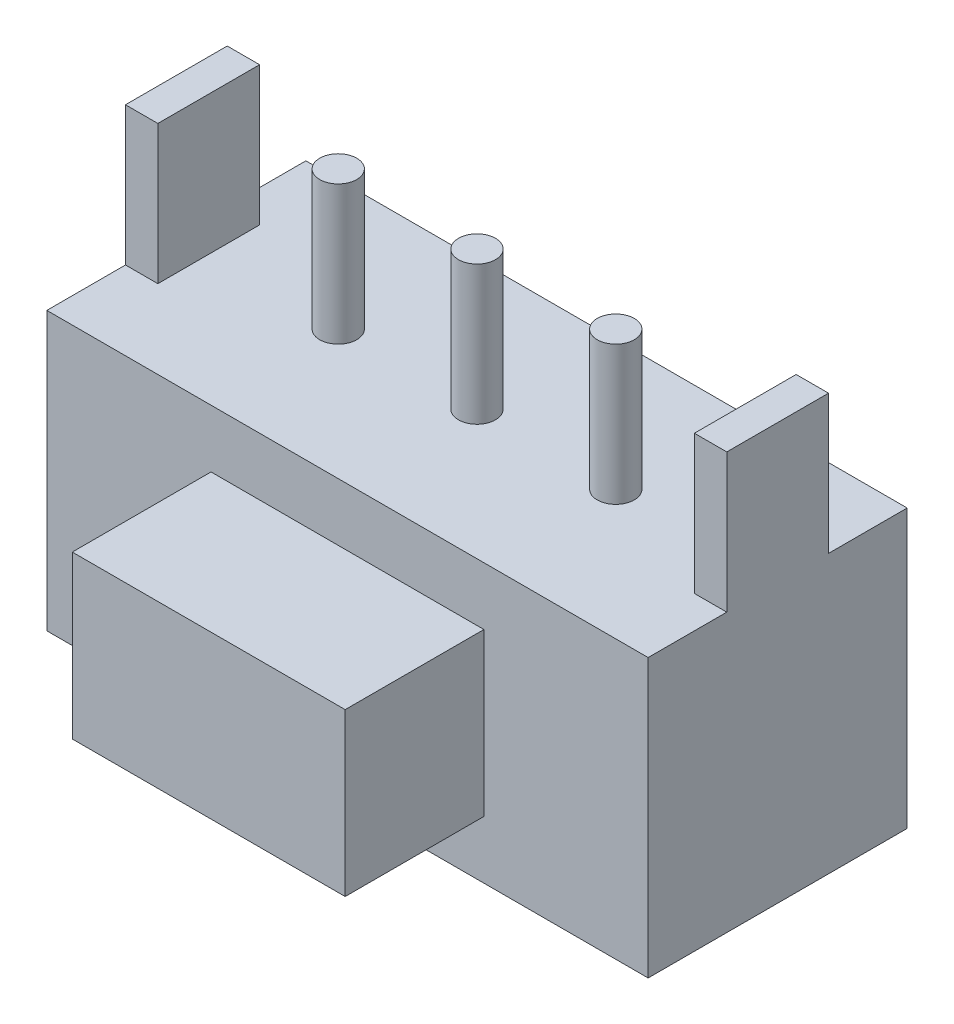
ISO-10303-21;
HEADER;
FILE_DESCRIPTION(('STEP AP214'),'2;1');
FILE_NAME('part.step','',(''),(''),'','','');
FILE_SCHEMA(('AUTOMOTIVE_DESIGN { 1 0 10303 214 1 1 1 1 }'));
ENDSEC;
DATA;
#1=APPLICATION_CONTEXT('core data for automotive mechanical design processes');
#2=APPLICATION_PROTOCOL_DEFINITION('international standard','automotive_design',2000,#1);
#3=PRODUCT_CONTEXT('',#1,'mechanical');
#4=PRODUCT('Part','Part','',(#3));
#5=PRODUCT_RELATED_PRODUCT_CATEGORY('part','',(#4));
#6=PRODUCT_DEFINITION_FORMATION('','',#4);
#7=PRODUCT_DEFINITION_CONTEXT('part definition',#1,'design');
#8=PRODUCT_DEFINITION('design','',#6,#7);
#9=PRODUCT_DEFINITION_SHAPE('','',#8);
#10=(LENGTH_UNIT() NAMED_UNIT(*) SI_UNIT(.MILLI.,.METRE.));
#11=(NAMED_UNIT(*) PLANE_ANGLE_UNIT() SI_UNIT($,.RADIAN.));
#12=(NAMED_UNIT(*) SI_UNIT($,.STERADIAN.) SOLID_ANGLE_UNIT());
#13=UNCERTAINTY_MEASURE_WITH_UNIT(LENGTH_MEASURE(1.E-05),#10,'distance_accuracy_value','');
#14=(GEOMETRIC_REPRESENTATION_CONTEXT(3) GLOBAL_UNCERTAINTY_ASSIGNED_CONTEXT((#13)) GLOBAL_UNIT_ASSIGNED_CONTEXT((#10,
#11,#12)) REPRESENTATION_CONTEXT('',''));
#15=CARTESIAN_POINT('',(0.,0.,0.));
#16=DIRECTION('',(0.,0.,1.));
#17=DIRECTION('',(1.,0.,0.));
#18=AXIS2_PLACEMENT_3D('',#15,#16,#17);
#19=CARTESIAN_POINT('',(-6.49999999999996,6.,2.8));
#20=DIRECTION('',(0.,0.,-1.));
#21=DIRECTION('',(-1.,0.,0.));
#22=AXIS2_PLACEMENT_3D('',#19,#20,#21);
#23=PLANE('',#22);
#24=DIRECTION('',(1.,0.,0.));
#25=VECTOR('',#24,1.);
#26=CARTESIAN_POINT('',(-6.49999999999996,0.,2.8));
#27=LINE('',#26,#25);
#28=CARTESIAN_POINT('',(-6.49999999999996,0.,2.8));
#29=VERTEX_POINT('',#28);
#30=CARTESIAN_POINT('',(6.49999999999998,0.,2.8));
#31=VERTEX_POINT('',#30);
#32=EDGE_CURVE('E290',#29,#31,#27,.T.);
#33=ORIENTED_EDGE('',*,*,#32,.T.);
#34=DIRECTION('',(0.,-1.,0.));
#35=VECTOR('',#34,1.);
#36=CARTESIAN_POINT('',(6.49999999999998,6.,2.8));
#37=LINE('',#36,#35);
#38=CARTESIAN_POINT('',(6.49999999999998,6.,2.8));
#39=VERTEX_POINT('',#38);
#40=EDGE_CURVE('E287',#39,#31,#37,.T.);
#41=ORIENTED_EDGE('',*,*,#40,.F.);
#42=DIRECTION('',(1.,0.,0.));
#43=VECTOR('',#42,1.);
#44=CARTESIAN_POINT('',(-6.49999999999996,6.,2.8));
#45=LINE('',#44,#43);
#46=CARTESIAN_POINT('',(-6.49999999999996,6.,2.8));
#47=VERTEX_POINT('',#46);
#48=EDGE_CURVE('E274',#47,#39,#45,.T.);
#49=ORIENTED_EDGE('',*,*,#48,.F.);
#50=DIRECTION('',(0.,-1.,0.));
#51=VECTOR('',#50,1.);
#52=CARTESIAN_POINT('',(-6.49999999999996,6.,2.8));
#53=LINE('',#52,#51);
#54=EDGE_CURVE('E284',#47,#29,#53,.T.);
#55=ORIENTED_EDGE('',*,*,#54,.T.);
#56=EDGE_LOOP('',(#33,#41,#49,#55));
#57=FACE_BOUND('',#56,.T.);
#58=DIRECTION('',(0.,1.,0.));
#59=VECTOR('',#58,1.);
#60=CARTESIAN_POINT('',(2.94999999999998,4.75,2.8));
#61=LINE('',#60,#59);
#62=CARTESIAN_POINT('',(2.94999999999998,1.25,2.8));
#63=VERTEX_POINT('',#62);
#64=CARTESIAN_POINT('',(2.94999999999998,4.75,2.8));
#65=VERTEX_POINT('',#64);
#66=EDGE_CURVE('E170',#63,#65,#61,.T.);
#67=ORIENTED_EDGE('',*,*,#66,.F.);
#68=DIRECTION('',(1.,0.,0.));
#69=VECTOR('',#68,1.);
#70=CARTESIAN_POINT('',(-2.94999999999998,1.25,2.8));
#71=LINE('',#70,#69);
#72=CARTESIAN_POINT('',(-2.94999999999998,1.25,2.8));
#73=VERTEX_POINT('',#72);
#74=EDGE_CURVE('E167',#73,#63,#71,.T.);
#75=ORIENTED_EDGE('',*,*,#74,.F.);
#76=DIRECTION('',(0.,-1.,0.));
#77=VECTOR('',#76,1.);
#78=CARTESIAN_POINT('',(-2.94999999999998,4.75,2.8));
#79=LINE('',#78,#77);
#80=CARTESIAN_POINT('',(-2.94999999999998,4.75,2.8));
#81=VERTEX_POINT('',#80);
#82=EDGE_CURVE('E57',#81,#73,#79,.T.);
#83=ORIENTED_EDGE('',*,*,#82,.F.);
#84=DIRECTION('',(-1.,0.,0.));
#85=VECTOR('',#84,1.);
#86=CARTESIAN_POINT('',(-2.94999999999998,4.75,2.8));
#87=LINE('',#86,#85);
#88=EDGE_CURVE('E52',#65,#81,#87,.T.);
#89=ORIENTED_EDGE('',*,*,#88,.F.);
#90=EDGE_LOOP('',(#67,#75,#83,#89));
#91=FACE_BOUND('',#90,.T.);
#92=ADVANCED_FACE('F35',(#57,#91),#23,.F.);
#93=CARTESIAN_POINT('',(0.,6.,0.));
#94=DIRECTION('',(0.,1.,0.));
#95=DIRECTION('',(0.,0.,1.));
#96=AXIS2_PLACEMENT_3D('',#93,#94,#95);
#97=PLANE('',#96);
#98=CARTESIAN_POINT('',(0.,6.,0.));
#99=DIRECTION('',(0.,1.,0.));
#100=DIRECTION('',(0.,0.,1.));
#101=AXIS2_PLACEMENT_3D('',#98,#99,#100);
#102=CIRCLE('',#101,0.4);
#103=CARTESIAN_POINT('',(0.,6.,0.400000000000002));
#104=VERTEX_POINT('',#103);
#105=EDGE_CURVE('E181',#104,#104,#102,.T.);
#106=ORIENTED_EDGE('',*,*,#105,.F.);
#107=EDGE_LOOP('',(#106));
#108=FACE_BOUND('',#107,.T.);
#109=CARTESIAN_POINT('',(-3.,6.,0.));
#110=DIRECTION('',(0.,1.,0.));
#111=DIRECTION('',(0.,0.,1.));
#112=AXIS2_PLACEMENT_3D('',#109,#110,#111);
#113=CIRCLE('',#112,0.4);
#114=CARTESIAN_POINT('',(-3.,6.,0.400000000000002));
#115=VERTEX_POINT('',#114);
#116=EDGE_CURVE('E218',#115,#115,#113,.T.);
#117=ORIENTED_EDGE('',*,*,#116,.F.);
#118=EDGE_LOOP('',(#117));
#119=FACE_BOUND('',#118,.T.);
#120=DIRECTION('',(0.,0.,1.));
#121=VECTOR('',#120,1.);
#122=CARTESIAN_POINT('',(5.79999999999997,6.,1.09999999999999));
#123=LINE('',#122,#121);
#124=CARTESIAN_POINT('',(5.79999999999997,6.,-1.10000000000001));
#125=VERTEX_POINT('',#124);
#126=CARTESIAN_POINT('',(5.79999999999997,6.,1.09999999999999));
#127=VERTEX_POINT('',#126);
#128=EDGE_CURVE('E202',#125,#127,#123,.T.);
#129=ORIENTED_EDGE('',*,*,#128,.F.);
#130=DIRECTION('',(-1.,0.,0.));
#131=VECTOR('',#130,1.);
#132=CARTESIAN_POINT('',(6.49999999999997,6.,-1.10000000000001));
#133=LINE('',#132,#131);
#134=CARTESIAN_POINT('',(6.49999999999997,6.,-1.10000000000001));
#135=VERTEX_POINT('',#134);
#136=EDGE_CURVE('E186',#135,#125,#133,.T.);
#137=ORIENTED_EDGE('',*,*,#136,.F.);
#138=DIRECTION('',(0.,0.,-1.));
#139=VECTOR('',#138,1.);
#140=CARTESIAN_POINT('',(6.49999999999999,6.,-2.8));
#141=LINE('',#140,#139);
#142=CARTESIAN_POINT('',(6.49999999999999,6.,-2.8));
#143=VERTEX_POINT('',#142);
#144=EDGE_CURVE('E269',#135,#143,#141,.T.);
#145=ORIENTED_EDGE('',*,*,#144,.T.);
#146=DIRECTION('',(-1.,0.,0.));
#147=VECTOR('',#146,1.);
#148=CARTESIAN_POINT('',(-6.49999999999999,6.,-2.8));
#149=LINE('',#148,#147);
#150=CARTESIAN_POINT('',(-6.49999999999999,6.,-2.8));
#151=VERTEX_POINT('',#150);
#152=EDGE_CURVE('E268',#143,#151,#149,.T.);
#153=ORIENTED_EDGE('',*,*,#152,.T.);
#154=DIRECTION('',(0.,0.,1.));
#155=VECTOR('',#154,1.);
#156=CARTESIAN_POINT('',(-6.49999999999999,6.,-2.8));
#157=LINE('',#156,#155);
#158=CARTESIAN_POINT('',(-6.49999999999998,6.,-1.1));
#159=VERTEX_POINT('',#158);
#160=EDGE_CURVE('E280',#151,#159,#157,.T.);
#161=ORIENTED_EDGE('',*,*,#160,.T.);
#162=DIRECTION('',(-1.,0.,0.));
#163=VECTOR('',#162,1.);
#164=CARTESIAN_POINT('',(-6.49999999999996,6.,-1.1));
#165=LINE('',#164,#163);
#166=CARTESIAN_POINT('',(-5.79999999999996,6.,-1.1));
#167=VERTEX_POINT('',#166);
#168=EDGE_CURVE('E229',#167,#159,#165,.T.);
#169=ORIENTED_EDGE('',*,*,#168,.F.);
#170=DIRECTION('',(0.,0.,-1.));
#171=VECTOR('',#170,1.);
#172=CARTESIAN_POINT('',(-5.79999999999996,6.,1.1));
#173=LINE('',#172,#171);
#174=CARTESIAN_POINT('',(-5.79999999999996,6.,1.1));
#175=VERTEX_POINT('',#174);
#176=EDGE_CURVE('E236',#175,#167,#173,.T.);
#177=ORIENTED_EDGE('',*,*,#176,.F.);
#178=DIRECTION('',(1.,0.,0.));
#179=VECTOR('',#178,1.);
#180=CARTESIAN_POINT('',(-6.49999999999996,6.,1.1));
#181=LINE('',#180,#179);
#182=CARTESIAN_POINT('',(-6.49999999999997,6.,1.1));
#183=VERTEX_POINT('',#182);
#184=EDGE_CURVE('E222',#183,#175,#181,.T.);
#185=ORIENTED_EDGE('',*,*,#184,.F.);
#186=EDGE_CURVE('E271',#183,#47,#157,.T.);
#187=ORIENTED_EDGE('',*,*,#186,.T.);
#188=ORIENTED_EDGE('',*,*,#48,.T.);
#189=CARTESIAN_POINT('',(6.49999999999998,6.,1.09999999999999));
#190=VERTEX_POINT('',#189);
#191=EDGE_CURVE('E266',#39,#190,#141,.T.);
#192=ORIENTED_EDGE('',*,*,#191,.T.);
#193=DIRECTION('',(1.,0.,0.));
#194=VECTOR('',#193,1.);
#195=CARTESIAN_POINT('',(6.49999999999997,6.,1.09999999999999));
#196=LINE('',#195,#194);
#197=EDGE_CURVE('E193',#127,#190,#196,.T.);
#198=ORIENTED_EDGE('',*,*,#197,.F.);
#199=EDGE_LOOP('',(#129,#137,#145,#153,#161,#169,#177,#185,#187,#188,#192,#198));
#200=FACE_BOUND('',#199,.T.);
#201=CARTESIAN_POINT('',(3.,6.,0.));
#202=DIRECTION('',(0.,1.,0.));
#203=DIRECTION('',(0.,0.,1.));
#204=AXIS2_PLACEMENT_3D('',#201,#202,#203);
#205=CIRCLE('',#204,0.4);
#206=CARTESIAN_POINT('',(3.,6.,0.400000000000002));
#207=VERTEX_POINT('',#206);
#208=EDGE_CURVE('E171',#207,#207,#205,.T.);
#209=ORIENTED_EDGE('',*,*,#208,.F.);
#210=EDGE_LOOP('',(#209));
#211=FACE_BOUND('',#210,.T.);
#212=ADVANCED_FACE('F310',(#108,#119,#200,#211),#97,.T.);
#213=CARTESIAN_POINT('',(6.49999999999999,6.,-2.8));
#214=DIRECTION('',(-1.,0.,0.));
#215=DIRECTION('',(0.,0.,1.));
#216=AXIS2_PLACEMENT_3D('',#213,#214,#215);
#217=PLANE('',#216);
#218=DIRECTION('',(0.,0.,-1.));
#219=VECTOR('',#218,1.);
#220=CARTESIAN_POINT('',(6.49999999999999,0.,-2.8));
#221=LINE('',#220,#219);
#222=CARTESIAN_POINT('',(6.49999999999999,0.,-2.8));
#223=VERTEX_POINT('',#222);
#224=EDGE_CURVE('E264',#31,#223,#221,.T.);
#225=ORIENTED_EDGE('',*,*,#224,.T.);
#226=DIRECTION('',(0.,-1.,0.));
#227=VECTOR('',#226,1.);
#228=CARTESIAN_POINT('',(6.49999999999999,6.,-2.8));
#229=LINE('',#228,#227);
#230=EDGE_CURVE('E11',#143,#223,#229,.T.);
#231=ORIENTED_EDGE('',*,*,#230,.F.);
#232=ORIENTED_EDGE('',*,*,#144,.F.);
#233=DIRECTION('',(0.,-1.,0.));
#234=VECTOR('',#233,1.);
#235=CARTESIAN_POINT('',(6.49999999999997,9.,-1.10000000000001));
#236=LINE('',#235,#234);
#237=CARTESIAN_POINT('',(6.49999999999997,9.,-1.10000000000001));
#238=VERTEX_POINT('',#237);
#239=EDGE_CURVE('E215',#238,#135,#236,.T.);
#240=ORIENTED_EDGE('',*,*,#239,.F.);
#241=DIRECTION('',(0.,0.,-1.));
#242=VECTOR('',#241,1.);
#243=CARTESIAN_POINT('',(6.49999999999997,9.,1.09999999999999));
#244=LINE('',#243,#242);
#245=CARTESIAN_POINT('',(6.49999999999997,9.,1.09999999999999));
#246=VERTEX_POINT('',#245);
#247=EDGE_CURVE('E189',#246,#238,#244,.T.);
#248=ORIENTED_EDGE('',*,*,#247,.F.);
#249=DIRECTION('',(0.,-1.,0.));
#250=VECTOR('',#249,1.);
#251=CARTESIAN_POINT('',(6.49999999999997,9.,1.09999999999999));
#252=LINE('',#251,#250);
#253=EDGE_CURVE('E199',#246,#190,#252,.T.);
#254=ORIENTED_EDGE('',*,*,#253,.T.);
#255=ORIENTED_EDGE('',*,*,#191,.F.);
#256=ORIENTED_EDGE('',*,*,#40,.T.);
#257=EDGE_LOOP('',(#225,#231,#232,#240,#248,#254,#255,#256));
#258=FACE_BOUND('',#257,.T.);
#259=ADVANCED_FACE('F37',(#258),#217,.F.);
#260=CARTESIAN_POINT('',(-6.49999999999999,6.,-2.8));
#261=DIRECTION('',(0.,0.,1.));
#262=DIRECTION('',(1.,0.,0.));
#263=AXIS2_PLACEMENT_3D('',#260,#261,#262);
#264=PLANE('',#263);
#265=DIRECTION('',(-1.,0.,0.));
#266=VECTOR('',#265,1.);
#267=CARTESIAN_POINT('',(-6.49999999999999,0.,-2.8));
#268=LINE('',#267,#266);
#269=CARTESIAN_POINT('',(-6.49999999999999,0.,-2.8));
#270=VERTEX_POINT('',#269);
#271=EDGE_CURVE('E294',#223,#270,#268,.T.);
#272=ORIENTED_EDGE('',*,*,#271,.T.);
#273=DIRECTION('',(0.,-1.,0.));
#274=VECTOR('',#273,1.);
#275=CARTESIAN_POINT('',(-6.49999999999999,6.,-2.8));
#276=LINE('',#275,#274);
#277=EDGE_CURVE('E44',#151,#270,#276,.T.);
#278=ORIENTED_EDGE('',*,*,#277,.F.);
#279=ORIENTED_EDGE('',*,*,#152,.F.);
#280=ORIENTED_EDGE('',*,*,#230,.T.);
#281=EDGE_LOOP('',(#272,#278,#279,#280));
#282=FACE_BOUND('',#281,.T.);
#283=ADVANCED_FACE('F308',(#282),#264,.F.);
#284=CARTESIAN_POINT('',(-6.49999999999999,6.,-2.8));
#285=DIRECTION('',(1.,0.,0.));
#286=DIRECTION('',(0.,0.,-1.));
#287=AXIS2_PLACEMENT_3D('',#284,#285,#286);
#288=PLANE('',#287);
#289=DIRECTION('',(0.,0.,1.));
#290=VECTOR('',#289,1.);
#291=CARTESIAN_POINT('',(-6.49999999999999,0.,-2.8));
#292=LINE('',#291,#290);
#293=EDGE_CURVE('E292',#270,#29,#292,.T.);
#294=ORIENTED_EDGE('',*,*,#293,.T.);
#295=ORIENTED_EDGE('',*,*,#54,.F.);
#296=ORIENTED_EDGE('',*,*,#186,.F.);
#297=DIRECTION('',(0.,-1.,0.));
#298=VECTOR('',#297,1.);
#299=CARTESIAN_POINT('',(-6.49999999999996,9.,1.1));
#300=LINE('',#299,#298);
#301=CARTESIAN_POINT('',(-6.49999999999996,9.,1.1));
#302=VERTEX_POINT('',#301);
#303=EDGE_CURVE('E259',#302,#183,#300,.T.);
#304=ORIENTED_EDGE('',*,*,#303,.F.);
#305=DIRECTION('',(0.,0.,1.));
#306=VECTOR('',#305,1.);
#307=CARTESIAN_POINT('',(-6.49999999999996,9.,1.1));
#308=LINE('',#307,#306);
#309=CARTESIAN_POINT('',(-6.49999999999996,9.,-1.1));
#310=VERTEX_POINT('',#309);
#311=EDGE_CURVE('E225',#310,#302,#308,.T.);
#312=ORIENTED_EDGE('',*,*,#311,.F.);
#313=DIRECTION('',(0.,-1.,0.));
#314=VECTOR('',#313,1.);
#315=CARTESIAN_POINT('',(-6.49999999999996,9.,-1.1));
#316=LINE('',#315,#314);
#317=EDGE_CURVE('E235',#310,#159,#316,.T.);
#318=ORIENTED_EDGE('',*,*,#317,.T.);
#319=ORIENTED_EDGE('',*,*,#160,.F.);
#320=ORIENTED_EDGE('',*,*,#277,.T.);
#321=EDGE_LOOP('',(#294,#295,#296,#304,#312,#318,#319,#320));
#322=FACE_BOUND('',#321,.T.);
#323=ADVANCED_FACE('F330',(#322),#288,.F.);
#324=CARTESIAN_POINT('',(0.,0.,0.));
#325=DIRECTION('',(0.,1.,0.));
#326=DIRECTION('',(0.,0.,1.));
#327=AXIS2_PLACEMENT_3D('',#324,#325,#326);
#328=PLANE('',#327);
#329=ORIENTED_EDGE('',*,*,#224,.F.);
#330=ORIENTED_EDGE('',*,*,#32,.F.);
#331=ORIENTED_EDGE('',*,*,#293,.F.);
#332=ORIENTED_EDGE('',*,*,#271,.F.);
#333=EDGE_LOOP('',(#329,#330,#331,#332));
#334=FACE_BOUND('',#333,.T.);
#335=ADVANCED_FACE('F303',(#334),#328,.F.);
#336=CARTESIAN_POINT('',(-6.49999999999996,9.,1.1));
#337=DIRECTION('',(0.,0.,-1.));
#338=DIRECTION('',(-1.,0.,0.));
#339=AXIS2_PLACEMENT_3D('',#336,#337,#338);
#340=PLANE('',#339);
#341=ORIENTED_EDGE('',*,*,#184,.T.);
#342=DIRECTION('',(0.,-1.,0.));
#343=VECTOR('',#342,1.);
#344=CARTESIAN_POINT('',(-5.79999999999996,9.,1.1));
#345=LINE('',#344,#343);
#346=CARTESIAN_POINT('',(-5.79999999999996,9.,1.1));
#347=VERTEX_POINT('',#346);
#348=EDGE_CURVE('E254',#347,#175,#345,.T.);
#349=ORIENTED_EDGE('',*,*,#348,.F.);
#350=DIRECTION('',(1.,0.,0.));
#351=VECTOR('',#350,1.);
#352=CARTESIAN_POINT('',(-6.49999999999996,9.,1.1));
#353=LINE('',#352,#351);
#354=EDGE_CURVE('E228',#302,#347,#353,.T.);
#355=ORIENTED_EDGE('',*,*,#354,.F.);
#356=ORIENTED_EDGE('',*,*,#303,.T.);
#357=EDGE_LOOP('',(#341,#349,#355,#356));
#358=FACE_BOUND('',#357,.T.);
#359=ADVANCED_FACE('F334',(#358),#340,.F.);
#360=CARTESIAN_POINT('',(-5.79999999999996,9.,1.1));
#361=DIRECTION('',(-1.,0.,0.));
#362=DIRECTION('',(0.,0.,1.));
#363=AXIS2_PLACEMENT_3D('',#360,#361,#362);
#364=PLANE('',#363);
#365=ORIENTED_EDGE('',*,*,#176,.T.);
#366=DIRECTION('',(0.,-1.,0.));
#367=VECTOR('',#366,1.);
#368=CARTESIAN_POINT('',(-5.79999999999996,9.,-1.1));
#369=LINE('',#368,#367);
#370=CARTESIAN_POINT('',(-5.79999999999996,9.,-1.1));
#371=VERTEX_POINT('',#370);
#372=EDGE_CURVE('E241',#371,#167,#369,.T.);
#373=ORIENTED_EDGE('',*,*,#372,.F.);
#374=DIRECTION('',(0.,0.,-1.));
#375=VECTOR('',#374,1.);
#376=CARTESIAN_POINT('',(-5.79999999999996,9.,1.1));
#377=LINE('',#376,#375);
#378=EDGE_CURVE('E231',#347,#371,#377,.T.);
#379=ORIENTED_EDGE('',*,*,#378,.F.);
#380=ORIENTED_EDGE('',*,*,#348,.T.);
#381=EDGE_LOOP('',(#365,#373,#379,#380));
#382=FACE_BOUND('',#381,.T.);
#383=ADVANCED_FACE('F338',(#382),#364,.F.);
#384=CARTESIAN_POINT('',(-6.49999999999996,9.,-1.1));
#385=DIRECTION('',(0.,0.,1.));
#386=DIRECTION('',(1.,0.,0.));
#387=AXIS2_PLACEMENT_3D('',#384,#385,#386);
#388=PLANE('',#387);
#389=ORIENTED_EDGE('',*,*,#168,.T.);
#390=ORIENTED_EDGE('',*,*,#317,.F.);
#391=DIRECTION('',(-1.,0.,0.));
#392=VECTOR('',#391,1.);
#393=CARTESIAN_POINT('',(-6.49999999999996,9.,-1.1));
#394=LINE('',#393,#392);
#395=EDGE_CURVE('E233',#371,#310,#394,.T.);
#396=ORIENTED_EDGE('',*,*,#395,.F.);
#397=ORIENTED_EDGE('',*,*,#372,.T.);
#398=EDGE_LOOP('',(#389,#390,#396,#397));
#399=FACE_BOUND('',#398,.T.);
#400=ADVANCED_FACE('F337',(#399),#388,.F.);
#401=CARTESIAN_POINT('',(0.,9.,0.));
#402=DIRECTION('',(0.,-1.,0.));
#403=DIRECTION('',(0.,0.,-1.));
#404=AXIS2_PLACEMENT_3D('',#401,#402,#403);
#405=PLANE('',#404);
#406=ORIENTED_EDGE('',*,*,#311,.T.);
#407=ORIENTED_EDGE('',*,*,#354,.T.);
#408=ORIENTED_EDGE('',*,*,#378,.T.);
#409=ORIENTED_EDGE('',*,*,#395,.T.);
#410=EDGE_LOOP('',(#406,#407,#408,#409));
#411=FACE_BOUND('',#410,.T.);
#412=ADVANCED_FACE('F336',(#411),#405,.F.);
#413=CARTESIAN_POINT('',(-3.,9.,0.));
#414=DIRECTION('',(0.,-1.,0.));
#415=DIRECTION('',(0.,0.,-1.));
#416=AXIS2_PLACEMENT_3D('',#413,#414,#415);
#417=CYLINDRICAL_SURFACE('',#416,0.4);
#418=CARTESIAN_POINT('',(-3.,9.,0.));
#419=DIRECTION('',(0.,1.,0.));
#420=DIRECTION('',(0.,0.,1.));
#421=AXIS2_PLACEMENT_3D('',#418,#419,#420);
#422=CIRCLE('',#421,0.4);
#423=CARTESIAN_POINT('',(-3.,9.,0.400000000000002));
#424=VERTEX_POINT('',#423);
#425=EDGE_CURVE('E219',#424,#424,#422,.T.);
#426=ORIENTED_EDGE('',*,*,#425,.F.);
#427=EDGE_LOOP('',(#426));
#428=FACE_BOUND('',#427,.T.);
#429=ORIENTED_EDGE('',*,*,#116,.T.);
#430=EDGE_LOOP('',(#429));
#431=FACE_BOUND('',#430,.T.);
#432=ADVANCED_FACE('F415',(#428,#431),#417,.T.);
#433=CARTESIAN_POINT('',(-3.,9.,0.));
#434=DIRECTION('',(0.,1.,0.));
#435=DIRECTION('',(0.,0.,1.));
#436=AXIS2_PLACEMENT_3D('',#433,#434,#435);
#437=PLANE('',#436);
#438=ORIENTED_EDGE('',*,*,#425,.T.);
#439=EDGE_LOOP('',(#438));
#440=FACE_BOUND('',#439,.T.);
#441=ADVANCED_FACE('F423',(#440),#437,.T.);
#442=CARTESIAN_POINT('',(6.49999999999997,9.,-1.10000000000001));
#443=DIRECTION('',(0.,0.,1.));
#444=DIRECTION('',(1.,0.,0.));
#445=AXIS2_PLACEMENT_3D('',#442,#443,#444);
#446=PLANE('',#445);
#447=ORIENTED_EDGE('',*,*,#136,.T.);
#448=DIRECTION('',(0.,-1.,0.));
#449=VECTOR('',#448,1.);
#450=CARTESIAN_POINT('',(5.79999999999997,9.,-1.10000000000001));
#451=LINE('',#450,#449);
#452=CARTESIAN_POINT('',(5.79999999999997,9.,-1.10000000000001));
#453=VERTEX_POINT('',#452);
#454=EDGE_CURVE('E212',#453,#125,#451,.T.);
#455=ORIENTED_EDGE('',*,*,#454,.F.);
#456=DIRECTION('',(-1.,0.,0.));
#457=VECTOR('',#456,1.);
#458=CARTESIAN_POINT('',(6.49999999999997,9.,-1.10000000000001));
#459=LINE('',#458,#457);
#460=EDGE_CURVE('E192',#238,#453,#459,.T.);
#461=ORIENTED_EDGE('',*,*,#460,.F.);
#462=ORIENTED_EDGE('',*,*,#239,.T.);
#463=EDGE_LOOP('',(#447,#455,#461,#462));
#464=FACE_BOUND('',#463,.T.);
#465=ADVANCED_FACE('F316',(#464),#446,.F.);
#466=CARTESIAN_POINT('',(5.79999999999997,9.,1.09999999999999));
#467=DIRECTION('',(1.,0.,0.));
#468=DIRECTION('',(0.,0.,-1.));
#469=AXIS2_PLACEMENT_3D('',#466,#467,#468);
#470=PLANE('',#469);
#471=ORIENTED_EDGE('',*,*,#128,.T.);
#472=DIRECTION('',(0.,-1.,0.));
#473=VECTOR('',#472,1.);
#474=CARTESIAN_POINT('',(5.79999999999997,9.,1.09999999999999));
#475=LINE('',#474,#473);
#476=CARTESIAN_POINT('',(5.79999999999997,9.,1.09999999999999));
#477=VERTEX_POINT('',#476);
#478=EDGE_CURVE('E209',#477,#127,#475,.T.);
#479=ORIENTED_EDGE('',*,*,#478,.F.);
#480=DIRECTION('',(0.,0.,1.));
#481=VECTOR('',#480,1.);
#482=CARTESIAN_POINT('',(5.79999999999997,9.,1.09999999999999));
#483=LINE('',#482,#481);
#484=EDGE_CURVE('E195',#453,#477,#483,.T.);
#485=ORIENTED_EDGE('',*,*,#484,.F.);
#486=ORIENTED_EDGE('',*,*,#454,.T.);
#487=EDGE_LOOP('',(#471,#479,#485,#486));
#488=FACE_BOUND('',#487,.T.);
#489=ADVANCED_FACE('F441',(#488),#470,.F.);
#490=CARTESIAN_POINT('',(6.49999999999997,9.,1.09999999999999));
#491=DIRECTION('',(0.,0.,-1.));
#492=DIRECTION('',(-1.,0.,0.));
#493=AXIS2_PLACEMENT_3D('',#490,#491,#492);
#494=PLANE('',#493);
#495=ORIENTED_EDGE('',*,*,#197,.T.);
#496=ORIENTED_EDGE('',*,*,#253,.F.);
#497=DIRECTION('',(1.,0.,0.));
#498=VECTOR('',#497,1.);
#499=CARTESIAN_POINT('',(6.49999999999997,9.,1.09999999999999));
#500=LINE('',#499,#498);
#501=EDGE_CURVE('E197',#477,#246,#500,.T.);
#502=ORIENTED_EDGE('',*,*,#501,.F.);
#503=ORIENTED_EDGE('',*,*,#478,.T.);
#504=EDGE_LOOP('',(#495,#496,#502,#503));
#505=FACE_BOUND('',#504,.T.);
#506=ADVANCED_FACE('F325',(#505),#494,.F.);
#507=CARTESIAN_POINT('',(0.,9.,0.));
#508=DIRECTION('',(0.,1.,0.));
#509=DIRECTION('',(0.,0.,1.));
#510=AXIS2_PLACEMENT_3D('',#507,#508,#509);
#511=PLANE('',#510);
#512=ORIENTED_EDGE('',*,*,#247,.T.);
#513=ORIENTED_EDGE('',*,*,#460,.T.);
#514=ORIENTED_EDGE('',*,*,#484,.T.);
#515=ORIENTED_EDGE('',*,*,#501,.T.);
#516=EDGE_LOOP('',(#512,#513,#514,#515));
#517=FACE_BOUND('',#516,.T.);
#518=ADVANCED_FACE('F320',(#517),#511,.T.);
#519=CARTESIAN_POINT('',(0.,9.,0.));
#520=DIRECTION('',(0.,-1.,0.));
#521=DIRECTION('',(0.,0.,-1.));
#522=AXIS2_PLACEMENT_3D('',#519,#520,#521);
#523=CYLINDRICAL_SURFACE('',#522,0.4);
#524=CARTESIAN_POINT('',(0.,9.,0.));
#525=DIRECTION('',(0.,1.,0.));
#526=DIRECTION('',(0.,0.,1.));
#527=AXIS2_PLACEMENT_3D('',#524,#525,#526);
#528=CIRCLE('',#527,0.4);
#529=CARTESIAN_POINT('',(0.,9.,0.400000000000002));
#530=VERTEX_POINT('',#529);
#531=EDGE_CURVE('E183',#530,#530,#528,.T.);
#532=ORIENTED_EDGE('',*,*,#531,.F.);
#533=EDGE_LOOP('',(#532));
#534=FACE_BOUND('',#533,.T.);
#535=ORIENTED_EDGE('',*,*,#105,.T.);
#536=EDGE_LOOP('',(#535));
#537=FACE_BOUND('',#536,.T.);
#538=ADVANCED_FACE('F464',(#534,#537),#523,.T.);
#539=CARTESIAN_POINT('',(0.,9.,0.));
#540=DIRECTION('',(0.,1.,0.));
#541=DIRECTION('',(0.,0.,1.));
#542=AXIS2_PLACEMENT_3D('',#539,#540,#541);
#543=PLANE('',#542);
#544=ORIENTED_EDGE('',*,*,#531,.T.);
#545=EDGE_LOOP('',(#544));
#546=FACE_BOUND('',#545,.T.);
#547=ADVANCED_FACE('F472',(#546),#543,.T.);
#548=CARTESIAN_POINT('',(3.,9.,0.));
#549=DIRECTION('',(0.,-1.,0.));
#550=DIRECTION('',(0.,0.,-1.));
#551=AXIS2_PLACEMENT_3D('',#548,#549,#550);
#552=CYLINDRICAL_SURFACE('',#551,0.4);
#553=CARTESIAN_POINT('',(3.,9.,0.));
#554=DIRECTION('',(0.,1.,0.));
#555=DIRECTION('',(0.,0.,1.));
#556=AXIS2_PLACEMENT_3D('',#553,#554,#555);
#557=CIRCLE('',#556,0.4);
#558=CARTESIAN_POINT('',(3.,9.,0.400000000000002));
#559=VERTEX_POINT('',#558);
#560=EDGE_CURVE('E174',#559,#559,#557,.T.);
#561=ORIENTED_EDGE('',*,*,#560,.F.);
#562=EDGE_LOOP('',(#561));
#563=FACE_BOUND('',#562,.T.);
#564=ORIENTED_EDGE('',*,*,#208,.T.);
#565=EDGE_LOOP('',(#564));
#566=FACE_BOUND('',#565,.T.);
#567=ADVANCED_FACE('F482',(#563,#566),#552,.T.);
#568=CARTESIAN_POINT('',(3.,9.,0.));
#569=DIRECTION('',(0.,1.,0.));
#570=DIRECTION('',(0.,0.,1.));
#571=AXIS2_PLACEMENT_3D('',#568,#569,#570);
#572=PLANE('',#571);
#573=ORIENTED_EDGE('',*,*,#560,.T.);
#574=EDGE_LOOP('',(#573));
#575=FACE_BOUND('',#574,.T.);
#576=ADVANCED_FACE('F491',(#575),#572,.T.);
#577=CARTESIAN_POINT('',(2.94999999999998,4.75,5.8));
#578=DIRECTION('',(-1.,0.,0.));
#579=DIRECTION('',(0.,-1.,0.));
#580=AXIS2_PLACEMENT_3D('',#577,#578,#579);
#581=PLANE('',#580);
#582=ORIENTED_EDGE('',*,*,#66,.T.);
#583=DIRECTION('',(0.,0.,-1.));
#584=VECTOR('',#583,1.);
#585=CARTESIAN_POINT('',(2.94999999999998,4.75,5.8));
#586=LINE('',#585,#584);
#587=CARTESIAN_POINT('',(2.94999999999998,4.75,5.8));
#588=VERTEX_POINT('',#587);
#589=EDGE_CURVE('E151',#588,#65,#586,.T.);
#590=ORIENTED_EDGE('',*,*,#589,.F.);
#591=DIRECTION('',(0.,1.,0.));
#592=VECTOR('',#591,1.);
#593=CARTESIAN_POINT('',(2.94999999999998,4.75,5.8));
#594=LINE('',#593,#592);
#595=CARTESIAN_POINT('',(2.94999999999998,1.25,5.8));
#596=VERTEX_POINT('',#595);
#597=EDGE_CURVE('E158',#596,#588,#594,.T.);
#598=ORIENTED_EDGE('',*,*,#597,.F.);
#599=DIRECTION('',(0.,0.,-1.));
#600=VECTOR('',#599,1.);
#601=CARTESIAN_POINT('',(2.94999999999998,1.25,5.8));
#602=LINE('',#601,#600);
#603=EDGE_CURVE('E568',#596,#63,#602,.T.);
#604=ORIENTED_EDGE('',*,*,#603,.T.);
#605=EDGE_LOOP('',(#582,#590,#598,#604));
#606=FACE_BOUND('',#605,.T.);
#607=ADVANCED_FACE('F169',(#606),#581,.F.);
#608=CARTESIAN_POINT('',(-2.94999999999998,4.75,5.8));
#609=DIRECTION('',(0.,-1.,0.));
#610=DIRECTION('',(0.,0.,-1.));
#611=AXIS2_PLACEMENT_3D('',#608,#609,#610);
#612=PLANE('',#611);
#613=ORIENTED_EDGE('',*,*,#88,.T.);
#614=DIRECTION('',(0.,0.,-1.));
#615=VECTOR('',#614,1.);
#616=CARTESIAN_POINT('',(-2.94999999999998,4.75,5.8));
#617=LINE('',#616,#615);
#618=CARTESIAN_POINT('',(-2.94999999999998,4.75,5.8));
#619=VERTEX_POINT('',#618);
#620=EDGE_CURVE('E154',#619,#81,#617,.T.);
#621=ORIENTED_EDGE('',*,*,#620,.F.);
#622=DIRECTION('',(-1.,0.,0.));
#623=VECTOR('',#622,1.);
#624=CARTESIAN_POINT('',(-2.94999999999998,4.75,5.8));
#625=LINE('',#624,#623);
#626=EDGE_CURVE('E147',#588,#619,#625,.T.);
#627=ORIENTED_EDGE('',*,*,#626,.F.);
#628=ORIENTED_EDGE('',*,*,#589,.T.);
#629=EDGE_LOOP('',(#613,#621,#627,#628));
#630=FACE_BOUND('',#629,.T.);
#631=ADVANCED_FACE('F149',(#630),#612,.F.);
#632=CARTESIAN_POINT('',(-2.94999999999998,4.75,5.8));
#633=DIRECTION('',(1.,0.,0.));
#634=DIRECTION('',(0.,0.,-1.));
#635=AXIS2_PLACEMENT_3D('',#632,#633,#634);
#636=PLANE('',#635);
#637=ORIENTED_EDGE('',*,*,#82,.T.);
#638=DIRECTION('',(0.,0.,-1.));
#639=VECTOR('',#638,1.);
#640=CARTESIAN_POINT('',(-2.94999999999998,1.25,5.8));
#641=LINE('',#640,#639);
#642=CARTESIAN_POINT('',(-2.94999999999998,1.25,5.8));
#643=VERTEX_POINT('',#642);
#644=EDGE_CURVE('E176',#643,#73,#641,.T.);
#645=ORIENTED_EDGE('',*,*,#644,.F.);
#646=DIRECTION('',(0.,-1.,0.));
#647=VECTOR('',#646,1.);
#648=CARTESIAN_POINT('',(-2.94999999999998,4.75,5.8));
#649=LINE('',#648,#647);
#650=EDGE_CURVE('E157',#619,#643,#649,.T.);
#651=ORIENTED_EDGE('',*,*,#650,.F.);
#652=ORIENTED_EDGE('',*,*,#620,.T.);
#653=EDGE_LOOP('',(#637,#645,#651,#652));
#654=FACE_BOUND('',#653,.T.);
#655=ADVANCED_FACE('F520',(#654),#636,.F.);
#656=CARTESIAN_POINT('',(-2.94999999999998,1.25,5.8));
#657=DIRECTION('',(0.,1.,0.));
#658=DIRECTION('',(0.,0.,1.));
#659=AXIS2_PLACEMENT_3D('',#656,#657,#658);
#660=PLANE('',#659);
#661=ORIENTED_EDGE('',*,*,#74,.T.);
#662=ORIENTED_EDGE('',*,*,#603,.F.);
#663=DIRECTION('',(1.,0.,0.));
#664=VECTOR('',#663,1.);
#665=CARTESIAN_POINT('',(-2.94999999999998,1.25,5.8));
#666=LINE('',#665,#664);
#667=EDGE_CURVE('E163',#643,#596,#666,.T.);
#668=ORIENTED_EDGE('',*,*,#667,.F.);
#669=ORIENTED_EDGE('',*,*,#644,.T.);
#670=EDGE_LOOP('',(#661,#662,#668,#669));
#671=FACE_BOUND('',#670,.T.);
#672=ADVANCED_FACE('F528',(#671),#660,.F.);
#673=CARTESIAN_POINT('',(0.,0.,5.8));
#674=DIRECTION('',(0.,0.,1.));
#675=DIRECTION('',(1.,0.,0.));
#676=AXIS2_PLACEMENT_3D('',#673,#674,#675);
#677=PLANE('',#676);
#678=ORIENTED_EDGE('',*,*,#597,.T.);
#679=ORIENTED_EDGE('',*,*,#626,.T.);
#680=ORIENTED_EDGE('',*,*,#650,.T.);
#681=ORIENTED_EDGE('',*,*,#667,.T.);
#682=EDGE_LOOP('',(#678,#679,#680,#681));
#683=FACE_BOUND('',#682,.T.);
#684=ADVANCED_FACE('F161',(#683),#677,.T.);
#685=CLOSED_SHELL('',(#92,#212,#259,#283,#323,#335,#359,#383,#400,#412,#432,#441,#465,#489,#506,
#518,#538,#547,#567,#576,#607,#631,#655,#672,#684));
#686=MANIFOLD_SOLID_BREP('B2',#685);
#687=ADVANCED_BREP_SHAPE_REPRESENTATION('',(#18,#686),#14);
#688=SHAPE_DEFINITION_REPRESENTATION(#9,#687);
ENDSEC;
END-ISO-10303-21;
